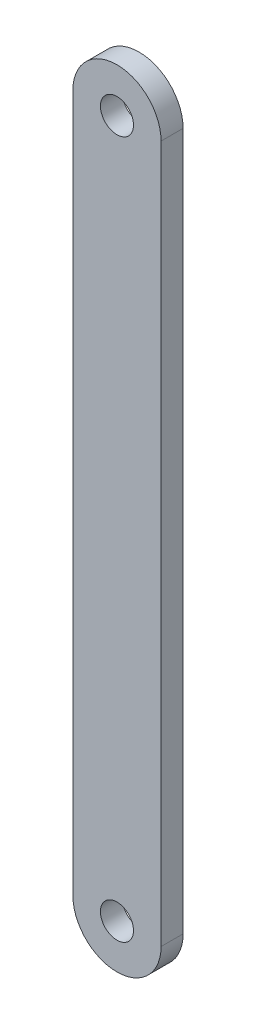
ISO-10303-21;
HEADER;
FILE_DESCRIPTION(('STEP AP214'),'2;1');
FILE_NAME('part.step','',(''),(''),'','','');
FILE_SCHEMA(('AUTOMOTIVE_DESIGN { 1 0 10303 214 1 1 1 1 }'));
ENDSEC;
DATA;
#1=APPLICATION_CONTEXT('core data for automotive mechanical design processes');
#2=APPLICATION_PROTOCOL_DEFINITION('international standard','automotive_design',2000,#1);
#3=PRODUCT_CONTEXT('',#1,'mechanical');
#4=PRODUCT('Part','Part','',(#3));
#5=PRODUCT_RELATED_PRODUCT_CATEGORY('part','',(#4));
#6=PRODUCT_DEFINITION_FORMATION('','',#4);
#7=PRODUCT_DEFINITION_CONTEXT('part definition',#1,'design');
#8=PRODUCT_DEFINITION('design','',#6,#7);
#9=PRODUCT_DEFINITION_SHAPE('','',#8);
#10=(LENGTH_UNIT() NAMED_UNIT(*) SI_UNIT(.MILLI.,.METRE.));
#11=(NAMED_UNIT(*) PLANE_ANGLE_UNIT() SI_UNIT($,.RADIAN.));
#12=(NAMED_UNIT(*) SI_UNIT($,.STERADIAN.) SOLID_ANGLE_UNIT());
#13=UNCERTAINTY_MEASURE_WITH_UNIT(LENGTH_MEASURE(1.E-05),#10,'distance_accuracy_value','');
#14=(GEOMETRIC_REPRESENTATION_CONTEXT(3) GLOBAL_UNCERTAINTY_ASSIGNED_CONTEXT((#13)) GLOBAL_UNIT_ASSIGNED_CONTEXT((#10,
#11,#12)) REPRESENTATION_CONTEXT('',''));
#15=CARTESIAN_POINT('',(0.,0.,0.));
#16=DIRECTION('',(0.,0.,1.));
#17=DIRECTION('',(1.,0.,0.));
#18=AXIS2_PLACEMENT_3D('',#15,#16,#17);
#19=CARTESIAN_POINT('',(2.032,0.,1.016));
#20=DIRECTION('',(0.,0.,-1.));
#21=DIRECTION('',(-1.,0.,0.));
#22=AXIS2_PLACEMENT_3D('',#19,#20,#21);
#23=PLANE('',#22);
#24=CARTESIAN_POINT('',(2.032,0.,1.016));
#25=DIRECTION('',(0.,0.,1.));
#26=DIRECTION('',(-1.,0.,0.));
#27=AXIS2_PLACEMENT_3D('',#24,#25,#26);
#28=CIRCLE('',#27,2.032);
#29=CARTESIAN_POINT('',(0.,0.,1.016));
#30=VERTEX_POINT('',#29);
#31=CARTESIAN_POINT('',(4.064,0.,1.016));
#32=VERTEX_POINT('',#31);
#33=EDGE_CURVE('E84',#30,#32,#28,.T.);
#34=ORIENTED_EDGE('',*,*,#33,.T.);
#35=DIRECTION('',(0.,1.,0.));
#36=VECTOR('',#35,1.);
#37=CARTESIAN_POINT('',(4.06399999999999,32.1564,1.016));
#38=LINE('',#37,#36);
#39=CARTESIAN_POINT('',(4.06399999999999,32.1564,1.016));
#40=VERTEX_POINT('',#39);
#41=EDGE_CURVE('E79',#32,#40,#38,.T.);
#42=ORIENTED_EDGE('',*,*,#41,.T.);
#43=CARTESIAN_POINT('',(2.032,32.1564,1.016));
#44=DIRECTION('',(0.,0.,1.));
#45=DIRECTION('',(-1.,0.,0.));
#46=AXIS2_PLACEMENT_3D('',#43,#44,#45);
#47=CIRCLE('',#46,2.032);
#48=CARTESIAN_POINT('',(0.,32.1564,1.016));
#49=VERTEX_POINT('',#48);
#50=EDGE_CURVE('E82',#40,#49,#47,.T.);
#51=ORIENTED_EDGE('',*,*,#50,.T.);
#52=DIRECTION('',(0.,-1.,0.));
#53=VECTOR('',#52,1.);
#54=CARTESIAN_POINT('',(0.,0.,1.016));
#55=LINE('',#54,#53);
#56=EDGE_CURVE('E49',#49,#30,#55,.T.);
#57=ORIENTED_EDGE('',*,*,#56,.T.);
#58=EDGE_LOOP('',(#34,#42,#51,#57));
#59=FACE_BOUND('',#58,.T.);
#60=CARTESIAN_POINT('',(2.032,32.1564,1.016));
#61=DIRECTION('',(0.,0.,1.));
#62=DIRECTION('',(1.,0.,0.));
#63=AXIS2_PLACEMENT_3D('',#60,#61,#62);
#64=CIRCLE('',#63,0.762);
#65=CARTESIAN_POINT('',(2.794,32.1564,1.016));
#66=VERTEX_POINT('',#65);
#67=EDGE_CURVE('E99',#66,#66,#64,.T.);
#68=ORIENTED_EDGE('',*,*,#67,.F.);
#69=EDGE_LOOP('',(#68));
#70=FACE_BOUND('',#69,.T.);
#71=CARTESIAN_POINT('',(2.032,0.,1.016));
#72=DIRECTION('',(0.,0.,1.));
#73=DIRECTION('',(1.,0.,0.));
#74=AXIS2_PLACEMENT_3D('',#71,#72,#73);
#75=CIRCLE('',#74,0.762);
#76=CARTESIAN_POINT('',(2.794,0.,1.016));
#77=VERTEX_POINT('',#76);
#78=EDGE_CURVE('E114',#77,#77,#75,.T.);
#79=ORIENTED_EDGE('',*,*,#78,.F.);
#80=EDGE_LOOP('',(#79));
#81=FACE_BOUND('',#80,.T.);
#82=ADVANCED_FACE('F32',(#59,#70,#81),#23,.F.);
#83=CARTESIAN_POINT('',(2.032,0.,0.));
#84=DIRECTION('',(0.,0.,-1.));
#85=DIRECTION('',(-1.,0.,0.));
#86=AXIS2_PLACEMENT_3D('',#83,#84,#85);
#87=PLANE('',#86);
#88=CARTESIAN_POINT('',(2.032,32.1564,0.));
#89=DIRECTION('',(0.,0.,1.));
#90=DIRECTION('',(1.,0.,0.));
#91=AXIS2_PLACEMENT_3D('',#88,#89,#90);
#92=CIRCLE('',#91,0.762);
#93=CARTESIAN_POINT('',(2.794,32.1564,0.));
#94=VERTEX_POINT('',#93);
#95=EDGE_CURVE('E111',#94,#94,#92,.T.);
#96=ORIENTED_EDGE('',*,*,#95,.T.);
#97=EDGE_LOOP('',(#96));
#98=FACE_BOUND('',#97,.T.);
#99=CARTESIAN_POINT('',(2.032,0.,0.));
#100=DIRECTION('',(0.,0.,1.));
#101=DIRECTION('',(-1.,0.,0.));
#102=AXIS2_PLACEMENT_3D('',#99,#100,#101);
#103=CIRCLE('',#102,2.032);
#104=CARTESIAN_POINT('',(0.,0.,0.));
#105=VERTEX_POINT('',#104);
#106=CARTESIAN_POINT('',(4.064,0.,0.));
#107=VERTEX_POINT('',#106);
#108=EDGE_CURVE('E96',#105,#107,#103,.T.);
#109=ORIENTED_EDGE('',*,*,#108,.F.);
#110=DIRECTION('',(0.,-1.,0.));
#111=VECTOR('',#110,1.);
#112=CARTESIAN_POINT('',(0.,0.,0.));
#113=LINE('',#112,#111);
#114=CARTESIAN_POINT('',(0.,32.1564,0.));
#115=VERTEX_POINT('',#114);
#116=EDGE_CURVE('E72',#115,#105,#113,.T.);
#117=ORIENTED_EDGE('',*,*,#116,.F.);
#118=CARTESIAN_POINT('',(2.032,32.1564,0.));
#119=DIRECTION('',(0.,0.,1.));
#120=DIRECTION('',(-1.,0.,0.));
#121=AXIS2_PLACEMENT_3D('',#118,#119,#120);
#122=CIRCLE('',#121,2.032);
#123=CARTESIAN_POINT('',(4.06399999999999,32.1564,0.));
#124=VERTEX_POINT('',#123);
#125=EDGE_CURVE('E66',#124,#115,#122,.T.);
#126=ORIENTED_EDGE('',*,*,#125,.F.);
#127=DIRECTION('',(0.,1.,0.));
#128=VECTOR('',#127,1.);
#129=CARTESIAN_POINT('',(4.06399999999999,32.1564,0.));
#130=LINE('',#129,#128);
#131=EDGE_CURVE('E88',#107,#124,#130,.T.);
#132=ORIENTED_EDGE('',*,*,#131,.F.);
#133=EDGE_LOOP('',(#109,#117,#126,#132));
#134=FACE_BOUND('',#133,.T.);
#135=CARTESIAN_POINT('',(2.032,0.,0.));
#136=DIRECTION('',(0.,0.,1.));
#137=DIRECTION('',(1.,0.,0.));
#138=AXIS2_PLACEMENT_3D('',#135,#136,#137);
#139=CIRCLE('',#138,0.762);
#140=CARTESIAN_POINT('',(2.794,0.,0.));
#141=VERTEX_POINT('',#140);
#142=EDGE_CURVE('E117',#141,#141,#139,.T.);
#143=ORIENTED_EDGE('',*,*,#142,.T.);
#144=EDGE_LOOP('',(#143));
#145=FACE_BOUND('',#144,.T.);
#146=ADVANCED_FACE('F107',(#98,#134,#145),#87,.T.);
#147=CARTESIAN_POINT('',(2.032,0.,1.016));
#148=DIRECTION('',(0.,0.,-1.));
#149=DIRECTION('',(-1.,0.,0.));
#150=AXIS2_PLACEMENT_3D('',#147,#148,#149);
#151=CYLINDRICAL_SURFACE('',#150,2.032);
#152=ORIENTED_EDGE('',*,*,#108,.T.);
#153=DIRECTION('',(0.,0.,-1.));
#154=VECTOR('',#153,1.);
#155=CARTESIAN_POINT('',(4.064,0.,1.016));
#156=LINE('',#155,#154);
#157=EDGE_CURVE('E11',#32,#107,#156,.T.);
#158=ORIENTED_EDGE('',*,*,#157,.F.);
#159=ORIENTED_EDGE('',*,*,#33,.F.);
#160=DIRECTION('',(0.,0.,-1.));
#161=VECTOR('',#160,1.);
#162=CARTESIAN_POINT('',(0.,0.,1.016));
#163=LINE('',#162,#161);
#164=EDGE_CURVE('E92',#30,#105,#163,.T.);
#165=ORIENTED_EDGE('',*,*,#164,.T.);
#166=EDGE_LOOP('',(#152,#158,#159,#165));
#167=FACE_BOUND('',#166,.T.);
#168=ADVANCED_FACE('F34',(#167),#151,.T.);
#169=CARTESIAN_POINT('',(4.06399999999999,32.1564,1.016));
#170=DIRECTION('',(-1.,0.,0.));
#171=DIRECTION('',(0.,-1.,0.));
#172=AXIS2_PLACEMENT_3D('',#169,#170,#171);
#173=PLANE('',#172);
#174=ORIENTED_EDGE('',*,*,#131,.T.);
#175=DIRECTION('',(0.,0.,-1.));
#176=VECTOR('',#175,1.);
#177=CARTESIAN_POINT('',(4.06399999999999,32.1564,1.016));
#178=LINE('',#177,#176);
#179=EDGE_CURVE('E41',#40,#124,#178,.T.);
#180=ORIENTED_EDGE('',*,*,#179,.F.);
#181=ORIENTED_EDGE('',*,*,#41,.F.);
#182=ORIENTED_EDGE('',*,*,#157,.T.);
#183=EDGE_LOOP('',(#174,#180,#181,#182));
#184=FACE_BOUND('',#183,.T.);
#185=ADVANCED_FACE('F87',(#184),#173,.F.);
#186=CARTESIAN_POINT('',(2.032,32.1564,1.016));
#187=DIRECTION('',(0.,0.,-1.));
#188=DIRECTION('',(-1.,0.,0.));
#189=AXIS2_PLACEMENT_3D('',#186,#187,#188);
#190=CYLINDRICAL_SURFACE('',#189,2.032);
#191=ORIENTED_EDGE('',*,*,#125,.T.);
#192=DIRECTION('',(0.,0.,-1.));
#193=VECTOR('',#192,1.);
#194=CARTESIAN_POINT('',(0.,32.1564,1.016));
#195=LINE('',#194,#193);
#196=EDGE_CURVE('E89',#49,#115,#195,.T.);
#197=ORIENTED_EDGE('',*,*,#196,.F.);
#198=ORIENTED_EDGE('',*,*,#50,.F.);
#199=ORIENTED_EDGE('',*,*,#179,.T.);
#200=EDGE_LOOP('',(#191,#197,#198,#199));
#201=FACE_BOUND('',#200,.T.);
#202=ADVANCED_FACE('F90',(#201),#190,.T.);
#203=CARTESIAN_POINT('',(0.,0.,1.016));
#204=DIRECTION('',(1.,0.,0.));
#205=DIRECTION('',(0.,0.,-1.));
#206=AXIS2_PLACEMENT_3D('',#203,#204,#205);
#207=PLANE('',#206);
#208=ORIENTED_EDGE('',*,*,#116,.T.);
#209=ORIENTED_EDGE('',*,*,#164,.F.);
#210=ORIENTED_EDGE('',*,*,#56,.F.);
#211=ORIENTED_EDGE('',*,*,#196,.T.);
#212=EDGE_LOOP('',(#208,#209,#210,#211));
#213=FACE_BOUND('',#212,.T.);
#214=ADVANCED_FACE('F104',(#213),#207,.F.);
#215=CARTESIAN_POINT('',(2.032,32.1564,1.016));
#216=DIRECTION('',(0.,0.,-1.));
#217=DIRECTION('',(-1.,0.,0.));
#218=AXIS2_PLACEMENT_3D('',#215,#216,#217);
#219=CYLINDRICAL_SURFACE('',#218,0.762);
#220=ORIENTED_EDGE('',*,*,#67,.T.);
#221=EDGE_LOOP('',(#220));
#222=FACE_BOUND('',#221,.T.);
#223=ORIENTED_EDGE('',*,*,#95,.F.);
#224=EDGE_LOOP('',(#223));
#225=FACE_BOUND('',#224,.T.);
#226=ADVANCED_FACE('F134',(#222,#225),#219,.F.);
#227=CARTESIAN_POINT('',(2.032,0.,1.016));
#228=DIRECTION('',(0.,0.,-1.));
#229=DIRECTION('',(-1.,0.,0.));
#230=AXIS2_PLACEMENT_3D('',#227,#228,#229);
#231=CYLINDRICAL_SURFACE('',#230,0.762);
#232=ORIENTED_EDGE('',*,*,#78,.T.);
#233=EDGE_LOOP('',(#232));
#234=FACE_BOUND('',#233,.T.);
#235=ORIENTED_EDGE('',*,*,#142,.F.);
#236=EDGE_LOOP('',(#235));
#237=FACE_BOUND('',#236,.T.);
#238=ADVANCED_FACE('F123',(#234,#237),#231,.F.);
#239=CLOSED_SHELL('',(#82,#146,#168,#185,#202,#214,#226,#238));
#240=MANIFOLD_SOLID_BREP('B2',#239);
#241=ADVANCED_BREP_SHAPE_REPRESENTATION('',(#18,#240),#14);
#242=SHAPE_DEFINITION_REPRESENTATION(#9,#241);
ENDSEC;
END-ISO-10303-21;
